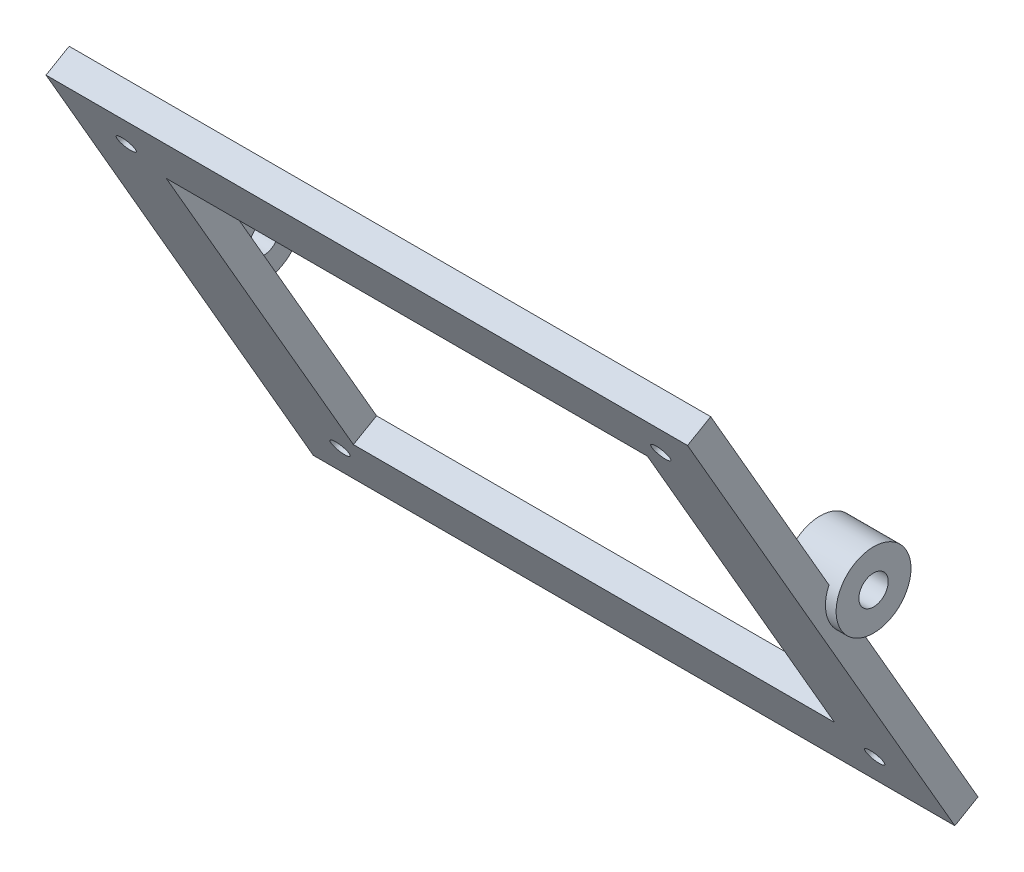
ISO-10303-21;
HEADER;
FILE_DESCRIPTION(('STEP AP214'),'2;1');
FILE_NAME('part.step','',(''),(''),'','','');
FILE_SCHEMA(('AUTOMOTIVE_DESIGN { 1 0 10303 214 1 1 1 1 }'));
ENDSEC;
DATA;
#1=APPLICATION_CONTEXT('core data for automotive mechanical design processes');
#2=APPLICATION_PROTOCOL_DEFINITION('international standard','automotive_design',2000,#1);
#3=PRODUCT_CONTEXT('',#1,'mechanical');
#4=PRODUCT('Part','Part','',(#3));
#5=PRODUCT_RELATED_PRODUCT_CATEGORY('part','',(#4));
#6=PRODUCT_DEFINITION_FORMATION('','',#4);
#7=PRODUCT_DEFINITION_CONTEXT('part definition',#1,'design');
#8=PRODUCT_DEFINITION('design','',#6,#7);
#9=PRODUCT_DEFINITION_SHAPE('','',#8);
#10=(LENGTH_UNIT() NAMED_UNIT(*) SI_UNIT(.MILLI.,.METRE.));
#11=(NAMED_UNIT(*) PLANE_ANGLE_UNIT() SI_UNIT($,.RADIAN.));
#12=(NAMED_UNIT(*) SI_UNIT($,.STERADIAN.) SOLID_ANGLE_UNIT());
#13=UNCERTAINTY_MEASURE_WITH_UNIT(LENGTH_MEASURE(1.E-05),#10,'distance_accuracy_value','');
#14=(GEOMETRIC_REPRESENTATION_CONTEXT(3) GLOBAL_UNCERTAINTY_ASSIGNED_CONTEXT((#13)) GLOBAL_UNIT_ASSIGNED_CONTEXT((#10,
#11,#12)) REPRESENTATION_CONTEXT('',''));
#15=CARTESIAN_POINT('',(0.,0.,0.));
#16=DIRECTION('',(0.,0.,1.));
#17=DIRECTION('',(1.,0.,0.));
#18=AXIS2_PLACEMENT_3D('',#15,#16,#17);
#19=CARTESIAN_POINT('',(114.0063,47.8013,21.535898384862));
#20=DIRECTION('',(1.,0.,0.));
#21=DIRECTION('',(0.,0.,-1.));
#22=AXIS2_PLACEMENT_3D('',#19,#20,#21);
#23=CYLINDRICAL_SURFACE('',#22,2.75);
#24=CARTESIAN_POINT('',(114.0063,47.8013,21.535898384862));
#25=DIRECTION('',(1.,0.,0.));
#26=DIRECTION('',(0.,0.,-1.));
#27=AXIS2_PLACEMENT_3D('',#24,#25,#26);
#28=CIRCLE('',#27,2.75);
#29=CARTESIAN_POINT('',(114.0063,47.8013,18.785898384862));
#30=VERTEX_POINT('',#29);
#31=EDGE_CURVE('E178',#30,#30,#28,.F.);
#32=ORIENTED_EDGE('',*,*,#31,.T.);
#33=EDGE_LOOP('',(#32));
#34=FACE_BOUND('',#33,.T.);
#35=CARTESIAN_POINT('',(124.0063,47.8013,21.535898384862));
#36=DIRECTION('',(1.,0.,0.));
#37=DIRECTION('',(0.,0.,-1.));
#38=AXIS2_PLACEMENT_3D('',#35,#36,#37);
#39=CIRCLE('',#38,2.75);
#40=CARTESIAN_POINT('',(124.0063,47.8013,18.785898384862));
#41=VERTEX_POINT('',#40);
#42=EDGE_CURVE('E180',#41,#41,#39,.F.);
#43=ORIENTED_EDGE('',*,*,#42,.F.);
#44=EDGE_LOOP('',(#43));
#45=FACE_BOUND('',#44,.T.);
#46=ADVANCED_FACE('F16',(#34,#45),#23,.F.);
#47=CARTESIAN_POINT('',(0.00630000000001,47.8013,21.535898384862));
#48=DIRECTION('',(1.,0.,0.));
#49=DIRECTION('',(0.,0.,-1.));
#50=AXIS2_PLACEMENT_3D('',#47,#48,#49);
#51=CYLINDRICAL_SURFACE('',#50,2.75);
#52=CARTESIAN_POINT('',(0.00630000000001,47.8013,21.535898384862));
#53=DIRECTION('',(1.,0.,0.));
#54=DIRECTION('',(0.,0.,-1.));
#55=AXIS2_PLACEMENT_3D('',#52,#53,#54);
#56=CIRCLE('',#55,2.75);
#57=CARTESIAN_POINT('',(0.00630000000001,47.8013,18.785898384862));
#58=VERTEX_POINT('',#57);
#59=EDGE_CURVE('E19',#58,#58,#56,.F.);
#60=ORIENTED_EDGE('',*,*,#59,.T.);
#61=EDGE_LOOP('',(#60));
#62=FACE_BOUND('',#61,.T.);
#63=CARTESIAN_POINT('',(10.0063,47.8013,21.535898384862));
#64=DIRECTION('',(1.,0.,0.));
#65=DIRECTION('',(0.,0.,-1.));
#66=AXIS2_PLACEMENT_3D('',#63,#64,#65);
#67=CIRCLE('',#66,2.75);
#68=CARTESIAN_POINT('',(10.0063,47.8013,18.785898384862));
#69=VERTEX_POINT('',#68);
#70=EDGE_CURVE('E119',#69,#69,#67,.F.);
#71=ORIENTED_EDGE('',*,*,#70,.F.);
#72=EDGE_LOOP('',(#71));
#73=FACE_BOUND('',#72,.T.);
#74=ADVANCED_FACE('F187',(#62,#73),#51,.F.);
#75=CARTESIAN_POINT('',(0.00630000000001,47.8013,21.535898384862));
#76=DIRECTION('',(1.,0.,0.));
#77=DIRECTION('',(0.,0.,-1.));
#78=AXIS2_PLACEMENT_3D('',#75,#76,#77);
#79=PLANE('',#78);
#80=ORIENTED_EDGE('',*,*,#59,.F.);
#81=EDGE_LOOP('',(#80));
#82=FACE_BOUND('',#81,.T.);
#83=CARTESIAN_POINT('',(0.00630000000001,47.8013,21.535898384862));
#84=DIRECTION('',(1.,0.,0.));
#85=DIRECTION('',(0.,0.,-1.));
#86=AXIS2_PLACEMENT_3D('',#83,#84,#85);
#87=CIRCLE('',#86,7.);
#88=CARTESIAN_POINT('',(0.00630000000001,47.8013,14.535898384862));
#89=VERTEX_POINT('',#88);
#90=EDGE_CURVE('E118',#89,#89,#87,.T.);
#91=ORIENTED_EDGE('',*,*,#90,.F.);
#92=EDGE_LOOP('',(#91));
#93=FACE_BOUND('',#92,.T.);
#94=ADVANCED_FACE('F190',(#82,#93),#79,.F.);
#95=CARTESIAN_POINT('',(124.0063,47.8013,21.535898384862));
#96=DIRECTION('',(1.,0.,0.));
#97=DIRECTION('',(0.,0.,-1.));
#98=AXIS2_PLACEMENT_3D('',#95,#96,#97);
#99=PLANE('',#98);
#100=ORIENTED_EDGE('',*,*,#42,.T.);
#101=EDGE_LOOP('',(#100));
#102=FACE_BOUND('',#101,.T.);
#103=CARTESIAN_POINT('',(124.0063,47.8013,21.535898384862));
#104=DIRECTION('',(1.,0.,0.));
#105=DIRECTION('',(0.,0.,-1.));
#106=AXIS2_PLACEMENT_3D('',#103,#104,#105);
#107=CIRCLE('',#106,7.);
#108=CARTESIAN_POINT('',(124.0063,47.8013,14.535898384862));
#109=VERTEX_POINT('',#108);
#110=EDGE_CURVE('E171',#109,#109,#107,.F.);
#111=ORIENTED_EDGE('',*,*,#110,.F.);
#112=EDGE_LOOP('',(#111));
#113=FACE_BOUND('',#112,.T.);
#114=ADVANCED_FACE('F193',(#102,#113),#99,.T.);
#115=CARTESIAN_POINT('',(114.0063,47.8013,21.535898384862));
#116=DIRECTION('',(1.,0.,0.));
#117=DIRECTION('',(0.,0.,-1.));
#118=AXIS2_PLACEMENT_3D('',#115,#116,#117);
#119=PLANE('',#118);
#120=ORIENTED_EDGE('',*,*,#31,.F.);
#121=EDGE_LOOP('',(#120));
#122=FACE_BOUND('',#121,.T.);
#123=DIRECTION('',(0.,-0.866025403784329,-0.50000000000019));
#124=VECTOR('',#123,1.);
#125=CARTESIAN_POINT('',(114.0063,2.500029810778,0.));
#126=LINE('',#125,#124);
#127=CARTESIAN_POINT('',(114.0063,40.826362814465,22.1277186767411));
#128=VERTEX_POINT('',#127);
#129=CARTESIAN_POINT('',(114.0063,50.7762371855231,27.8722813232774));
#130=VERTEX_POINT('',#129);
#131=EDGE_CURVE('E131',#128,#130,#126,.F.);
#132=ORIENTED_EDGE('',*,*,#131,.T.);
#133=CARTESIAN_POINT('',(114.0063,47.8013,21.535898384862));
#134=DIRECTION('',(1.,0.,0.));
#135=DIRECTION('',(0.,0.,-1.));
#136=AXIS2_PLACEMENT_3D('',#133,#134,#135);
#137=CIRCLE('',#136,7.);
#138=EDGE_CURVE('E168',#128,#130,#137,.T.);
#139=ORIENTED_EDGE('',*,*,#138,.F.);
#140=EDGE_LOOP('',(#132,#139));
#141=FACE_BOUND('',#140,.T.);
#142=ADVANCED_FACE('F207',(#122,#141),#119,.F.);
#143=CARTESIAN_POINT('',(10.0063,47.8013,21.535898384862));
#144=DIRECTION('',(1.,0.,0.));
#145=DIRECTION('',(0.,0.,-1.));
#146=AXIS2_PLACEMENT_3D('',#143,#144,#145);
#147=PLANE('',#146);
#148=ORIENTED_EDGE('',*,*,#70,.T.);
#149=EDGE_LOOP('',(#148));
#150=FACE_BOUND('',#149,.T.);
#151=DIRECTION('',(0.,-0.866025403784329,-0.50000000000019));
#152=VECTOR('',#151,1.);
#153=CARTESIAN_POINT('',(10.0063,2.500029810778,0.));
#154=LINE('',#153,#152);
#155=CARTESIAN_POINT('',(10.0063,50.7762371855231,27.8722813232774));
#156=VERTEX_POINT('',#155);
#157=CARTESIAN_POINT('',(10.0063,40.826362814465,22.1277186767411));
#158=VERTEX_POINT('',#157);
#159=EDGE_CURVE('E106',#156,#158,#154,.T.);
#160=ORIENTED_EDGE('',*,*,#159,.T.);
#161=CARTESIAN_POINT('',(10.0063,47.8013,21.535898384862));
#162=DIRECTION('',(1.,0.,0.));
#163=DIRECTION('',(0.,0.,-1.));
#164=AXIS2_PLACEMENT_3D('',#161,#162,#163);
#165=CIRCLE('',#164,7.);
#166=EDGE_CURVE('E103',#156,#158,#165,.F.);
#167=ORIENTED_EDGE('',*,*,#166,.F.);
#168=EDGE_LOOP('',(#160,#167));
#169=FACE_BOUND('',#168,.T.);
#170=ADVANCED_FACE('F107',(#150,#169),#147,.T.);
#171=CARTESIAN_POINT('',(0.00630000000001,47.8013,21.535898384862));
#172=DIRECTION('',(1.,0.,0.));
#173=DIRECTION('',(0.,0.,-1.));
#174=AXIS2_PLACEMENT_3D('',#171,#172,#173);
#175=CYLINDRICAL_SURFACE('',#174,7.);
#176=ORIENTED_EDGE('',*,*,#90,.T.);
#177=EDGE_LOOP('',(#176));
#178=FACE_BOUND('',#177,.T.);
#179=CARTESIAN_POINT('',(2.0063,47.8013,21.535898384862));
#180=DIRECTION('',(1.,0.,0.));
#181=DIRECTION('',(0.,0.,-1.));
#182=AXIS2_PLACEMENT_3D('',#179,#180,#181);
#183=CIRCLE('',#182,7.);
#184=CARTESIAN_POINT('',(2.0063,40.8263628144645,22.1277186767352));
#185=VERTEX_POINT('',#184);
#186=CARTESIAN_POINT('',(2.0063,50.7762371855299,27.8722813232742));
#187=VERTEX_POINT('',#186);
#188=EDGE_CURVE('E125',#185,#187,#183,.F.);
#189=ORIENTED_EDGE('',*,*,#188,.T.);
#190=DIRECTION('',(1.,0.,0.));
#191=VECTOR('',#190,1.);
#192=CARTESIAN_POINT('',(2.0063,50.7762371855269,27.8722813232796));
#193=LINE('',#192,#191);
#194=EDGE_CURVE('E112',#187,#156,#193,.T.);
#195=ORIENTED_EDGE('',*,*,#194,.T.);
#196=ORIENTED_EDGE('',*,*,#166,.T.);
#197=DIRECTION('',(1.,0.,0.));
#198=VECTOR('',#197,1.);
#199=CARTESIAN_POINT('',(2.0063,40.8263628144621,22.1277186767395));
#200=LINE('',#199,#198);
#201=EDGE_CURVE('E111',#158,#185,#200,.F.);
#202=ORIENTED_EDGE('',*,*,#201,.T.);
#203=EDGE_LOOP('',(#189,#195,#196,#202));
#204=FACE_BOUND('',#203,.T.);
#205=ADVANCED_FACE('F116',(#178,#204),#175,.T.);
#206=CARTESIAN_POINT('',(114.0063,47.8013,21.535898384862));
#207=DIRECTION('',(1.,0.,0.));
#208=DIRECTION('',(0.,0.,-1.));
#209=AXIS2_PLACEMENT_3D('',#206,#207,#208);
#210=CYLINDRICAL_SURFACE('',#209,7.);
#211=ORIENTED_EDGE('',*,*,#110,.T.);
#212=EDGE_LOOP('',(#211));
#213=FACE_BOUND('',#212,.T.);
#214=DIRECTION('',(1.,0.,0.));
#215=VECTOR('',#214,1.);
#216=CARTESIAN_POINT('',(2.0063,50.7762371855269,27.8722813232796));
#217=LINE('',#216,#215);
#218=CARTESIAN_POINT('',(122.0063,50.7762371855299,27.8722813232742));
#219=VERTEX_POINT('',#218);
#220=EDGE_CURVE('E132',#130,#219,#217,.T.);
#221=ORIENTED_EDGE('',*,*,#220,.T.);
#222=CARTESIAN_POINT('',(122.0063,47.8013,21.535898384862));
#223=DIRECTION('',(1.,0.,0.));
#224=DIRECTION('',(0.,0.,-1.));
#225=AXIS2_PLACEMENT_3D('',#222,#223,#224);
#226=CIRCLE('',#225,7.);
#227=CARTESIAN_POINT('',(122.0063,40.8263628144645,22.1277186767352));
#228=VERTEX_POINT('',#227);
#229=EDGE_CURVE('E161',#228,#219,#226,.F.);
#230=ORIENTED_EDGE('',*,*,#229,.F.);
#231=DIRECTION('',(1.,0.,0.));
#232=VECTOR('',#231,1.);
#233=CARTESIAN_POINT('',(2.0063,40.8263628144621,22.1277186767395));
#234=LINE('',#233,#232);
#235=EDGE_CURVE('E133',#228,#128,#234,.F.);
#236=ORIENTED_EDGE('',*,*,#235,.T.);
#237=ORIENTED_EDGE('',*,*,#138,.T.);
#238=EDGE_LOOP('',(#221,#230,#236,#237));
#239=FACE_BOUND('',#238,.T.);
#240=ADVANCED_FACE('F198',(#213,#239),#210,.T.);
#241=CARTESIAN_POINT('',(2.0063,2.500029810778,0.));
#242=DIRECTION('',(0.,-0.50000000000019,0.866025403784329));
#243=DIRECTION('',(0.,-0.866025403784329,-0.50000000000019));
#244=AXIS2_PLACEMENT_3D('',#241,#242,#243);
#245=PLANE('',#244);
#246=CARTESIAN_POINT('',(112.0063,80.442316151378,45.));
#247=DIRECTION('',(0.,-0.50000000000019,0.866025403784329));
#248=DIRECTION('',(0.,-0.866025403784329,-0.50000000000019));
#249=AXIS2_PLACEMENT_3D('',#246,#247,#248);
#250=CIRCLE('',#249,1.7);
#251=CARTESIAN_POINT('',(112.0063,78.9700729649446,44.1499999999997));
#252=VERTEX_POINT('',#251);
#253=EDGE_CURVE('E146',#252,#252,#250,.T.);
#254=ORIENTED_EDGE('',*,*,#253,.T.);
#255=EDGE_LOOP('',(#254));
#256=FACE_BOUND('',#255,.T.);
#257=DIRECTION('',(0.,0.866025403784436,0.500000000000004));
#258=VECTOR('',#257,1.);
#259=CARTESIAN_POINT('',(107.0063,15.490410867545,7.5));
#260=LINE('',#259,#258);
#261=CARTESIAN_POINT('',(107.0063,15.4904108675441,7.50000000000152));
#262=VERTEX_POINT('',#261);
#263=CARTESIAN_POINT('',(107.0063,76.1121891324504,42.500000000008));
#264=VERTEX_POINT('',#263);
#265=EDGE_CURVE('E272',#262,#264,#260,.T.);
#266=ORIENTED_EDGE('',*,*,#265,.T.);
#267=DIRECTION('',(1.,0.,0.));
#268=VECTOR('',#267,1.);
#269=CARTESIAN_POINT('',(17.0063,76.112189132455,42.5));
#270=LINE('',#269,#268);
#271=CARTESIAN_POINT('',(17.0063,76.1121891324504,42.500000000008));
#272=VERTEX_POINT('',#271);
#273=EDGE_CURVE('E346',#264,#272,#270,.F.);
#274=ORIENTED_EDGE('',*,*,#273,.T.);
#275=DIRECTION('',(0.,0.866025403784436,0.500000000000004));
#276=VECTOR('',#275,1.);
#277=CARTESIAN_POINT('',(17.0063,15.490410867545,7.5));
#278=LINE('',#277,#276);
#279=CARTESIAN_POINT('',(17.0063,15.4904108675441,7.50000000000152));
#280=VERTEX_POINT('',#279);
#281=EDGE_CURVE('E153',#280,#272,#278,.T.);
#282=ORIENTED_EDGE('',*,*,#281,.F.);
#283=DIRECTION('',(1.,0.,0.));
#284=VECTOR('',#283,1.);
#285=CARTESIAN_POINT('',(17.0063,15.490410867545,7.5));
#286=LINE('',#285,#284);
#287=EDGE_CURVE('E353',#262,#280,#286,.F.);
#288=ORIENTED_EDGE('',*,*,#287,.F.);
#289=EDGE_LOOP('',(#266,#274,#282,#288));
#290=FACE_BOUND('',#289,.T.);
#291=CARTESIAN_POINT('',(12.0063,80.442316151378,45.));
#292=DIRECTION('',(0.,-0.50000000000019,0.866025403784329));
#293=DIRECTION('',(0.,-0.866025403784329,-0.50000000000019));
#294=AXIS2_PLACEMENT_3D('',#291,#292,#293);
#295=CIRCLE('',#294,1.7);
#296=CARTESIAN_POINT('',(12.0063,78.9700729649446,44.1499999999997));
#297=VERTEX_POINT('',#296);
#298=EDGE_CURVE('E150',#297,#297,#295,.T.);
#299=ORIENTED_EDGE('',*,*,#298,.T.);
#300=EDGE_LOOP('',(#299));
#301=FACE_BOUND('',#300,.T.);
#302=CARTESIAN_POINT('',(112.0063,11.160283848622,5.));
#303=DIRECTION('',(0.,-0.50000000000019,0.866025403784329));
#304=DIRECTION('',(0.,-0.866025403784329,-0.50000000000019));
#305=AXIS2_PLACEMENT_3D('',#302,#303,#304);
#306=CIRCLE('',#305,1.7);
#307=CARTESIAN_POINT('',(112.0063,9.68804066218864,4.14999999999968));
#308=VERTEX_POINT('',#307);
#309=EDGE_CURVE('E154',#308,#308,#306,.T.);
#310=ORIENTED_EDGE('',*,*,#309,.T.);
#311=EDGE_LOOP('',(#310));
#312=FACE_BOUND('',#311,.T.);
#313=CARTESIAN_POINT('',(12.0063,11.160283848622,5.));
#314=DIRECTION('',(0.,-0.50000000000019,0.866025403784329));
#315=DIRECTION('',(0.,-0.866025403784329,-0.50000000000019));
#316=AXIS2_PLACEMENT_3D('',#313,#314,#315);
#317=CIRCLE('',#316,1.7);
#318=CARTESIAN_POINT('',(12.0063,9.68804066218864,4.14999999999968));
#319=VERTEX_POINT('',#318);
#320=EDGE_CURVE('E157',#319,#319,#317,.T.);
#321=ORIENTED_EDGE('',*,*,#320,.T.);
#322=EDGE_LOOP('',(#321));
#323=FACE_BOUND('',#322,.T.);
#324=ORIENTED_EDGE('',*,*,#159,.F.);
#325=ORIENTED_EDGE('',*,*,#194,.F.);
#326=DIRECTION('',(0.,0.866025403784439,0.499999999999999));
#327=VECTOR('',#326,1.);
#328=CARTESIAN_POINT('',(2.0063,50.776237185533,27.872281323269));
#329=LINE('',#328,#327);
#330=CARTESIAN_POINT('',(2.0063,89.102570189222,50.));
#331=VERTEX_POINT('',#330);
#332=EDGE_CURVE('E167',#187,#331,#329,.T.);
#333=ORIENTED_EDGE('',*,*,#332,.T.);
#334=DIRECTION('',(1.,0.,0.));
#335=VECTOR('',#334,1.);
#336=CARTESIAN_POINT('',(2.0063,89.102570189222,50.));
#337=LINE('',#336,#335);
#338=CARTESIAN_POINT('',(122.0063,89.102570189222,50.));
#339=VERTEX_POINT('',#338);
#340=EDGE_CURVE('E312',#339,#331,#337,.F.);
#341=ORIENTED_EDGE('',*,*,#340,.F.);
#342=DIRECTION('',(0.,0.866025403784439,0.499999999999999));
#343=VECTOR('',#342,1.);
#344=CARTESIAN_POINT('',(122.0063,50.776237185533,27.872281323269));
#345=LINE('',#344,#343);
#346=EDGE_CURVE('E164',#219,#339,#345,.T.);
#347=ORIENTED_EDGE('',*,*,#346,.F.);
#348=ORIENTED_EDGE('',*,*,#220,.F.);
#349=ORIENTED_EDGE('',*,*,#131,.F.);
#350=ORIENTED_EDGE('',*,*,#235,.F.);
#351=DIRECTION('',(0.,0.866025403784439,0.499999999999999));
#352=VECTOR('',#351,1.);
#353=CARTESIAN_POINT('',(122.0063,2.500029810778,0.));
#354=LINE('',#353,#352);
#355=CARTESIAN_POINT('',(122.0063,2.500029810778,0.));
#356=VERTEX_POINT('',#355);
#357=EDGE_CURVE('E165',#356,#228,#354,.T.);
#358=ORIENTED_EDGE('',*,*,#357,.F.);
#359=DIRECTION('',(1.,0.,0.));
#360=VECTOR('',#359,1.);
#361=CARTESIAN_POINT('',(2.0063,2.500029810778,0.));
#362=LINE('',#361,#360);
#363=CARTESIAN_POINT('',(2.0063,2.500029810778,0.));
#364=VERTEX_POINT('',#363);
#365=EDGE_CURVE('E307',#356,#364,#362,.F.);
#366=ORIENTED_EDGE('',*,*,#365,.T.);
#367=DIRECTION('',(0.,0.866025403784439,0.499999999999999));
#368=VECTOR('',#367,1.);
#369=CARTESIAN_POINT('',(2.0063,2.500029810778,0.));
#370=LINE('',#369,#368);
#371=EDGE_CURVE('E123',#364,#185,#370,.T.);
#372=ORIENTED_EDGE('',*,*,#371,.T.);
#373=ORIENTED_EDGE('',*,*,#201,.F.);
#374=EDGE_LOOP('',(#324,#325,#333,#341,#347,#348,#349,#350,#358,#366,#372,#373));
#375=FACE_BOUND('',#374,.T.);
#376=ADVANCED_FACE('F121',(#256,#290,#301,#312,#323,#375),#245,.F.);
#377=CARTESIAN_POINT('',(2.0063,2.500029810778,0.));
#378=DIRECTION('',(1.,0.,0.));
#379=DIRECTION('',(0.,0.,-1.));
#380=AXIS2_PLACEMENT_3D('',#377,#378,#379);
#381=PLANE('',#380);
#382=ORIENTED_EDGE('',*,*,#332,.F.);
#383=ORIENTED_EDGE('',*,*,#188,.F.);
#384=ORIENTED_EDGE('',*,*,#371,.F.);
#385=DIRECTION('',(0.,-0.50000000000019,0.866025403784329));
#386=VECTOR('',#385,1.);
#387=CARTESIAN_POINT('',(2.0063,2.500029810778,0.));
#388=LINE('',#387,#386);
#389=CARTESIAN_POINT('',(2.0063,2.98107778301914E-05,4.33012701892187));
#390=VERTEX_POINT('',#389);
#391=EDGE_CURVE('E304',#364,#390,#388,.T.);
#392=ORIENTED_EDGE('',*,*,#391,.T.);
#393=DIRECTION('',(0.,-0.866025403784329,-0.50000000000019));
#394=VECTOR('',#393,1.);
#395=CARTESIAN_POINT('',(2.0063,2.981077805941E-05,4.330127018922));
#396=LINE('',#395,#394);
#397=CARTESIAN_POINT('',(2.0063,86.6025701892191,54.3301270189266));
#398=VERTEX_POINT('',#397);
#399=EDGE_CURVE('E149',#398,#390,#396,.T.);
#400=ORIENTED_EDGE('',*,*,#399,.F.);
#401=DIRECTION('',(0.,-0.50000000000019,0.866025403784329));
#402=VECTOR('',#401,1.);
#403=CARTESIAN_POINT('',(2.0063,89.102570189222,50.));
#404=LINE('',#403,#402);
#405=EDGE_CURVE('E310',#331,#398,#404,.T.);
#406=ORIENTED_EDGE('',*,*,#405,.F.);
#407=EDGE_LOOP('',(#382,#383,#384,#392,#400,#406));
#408=FACE_BOUND('',#407,.T.);
#409=ADVANCED_FACE('F260',(#408),#381,.F.);
#410=CARTESIAN_POINT('',(2.0063,2.500029810778,0.));
#411=DIRECTION('',(0.,0.866025403784329,0.50000000000019));
#412=DIRECTION('',(0.,-0.50000000000019,0.866025403784329));
#413=AXIS2_PLACEMENT_3D('',#410,#411,#412);
#414=PLANE('',#413);
#415=DIRECTION('',(1.,0.,0.));
#416=VECTOR('',#415,1.);
#417=CARTESIAN_POINT('',(2.0063,2.981077805941E-05,4.330127018922));
#418=LINE('',#417,#416);
#419=CARTESIAN_POINT('',(122.0063,2.98107780589193E-05,4.330127018922));
#420=VERTEX_POINT('',#419);
#421=EDGE_CURVE('E291',#390,#420,#418,.T.);
#422=ORIENTED_EDGE('',*,*,#421,.F.);
#423=ORIENTED_EDGE('',*,*,#391,.F.);
#424=ORIENTED_EDGE('',*,*,#365,.F.);
#425=DIRECTION('',(0.,0.500000000000008,-0.866025403784434));
#426=VECTOR('',#425,1.);
#427=CARTESIAN_POINT('',(122.0063,2.98107780596218E-05,4.330127018922));
#428=LINE('',#427,#426);
#429=EDGE_CURVE('E306',#420,#356,#428,.T.);
#430=ORIENTED_EDGE('',*,*,#429,.F.);
#431=EDGE_LOOP('',(#422,#423,#424,#430));
#432=FACE_BOUND('',#431,.T.);
#433=ADVANCED_FACE('F256',(#432),#414,.F.);
#434=CARTESIAN_POINT('',(122.0063,2.500029810778,0.));
#435=DIRECTION('',(1.,0.,0.));
#436=DIRECTION('',(0.,0.,-1.));
#437=AXIS2_PLACEMENT_3D('',#434,#435,#436);
#438=PLANE('',#437);
#439=ORIENTED_EDGE('',*,*,#346,.T.);
#440=DIRECTION('',(0.,-0.50000000000019,0.866025403784329));
#441=VECTOR('',#440,1.);
#442=CARTESIAN_POINT('',(122.0063,89.102570189222,50.));
#443=LINE('',#442,#441);
#444=CARTESIAN_POINT('',(122.0063,86.6025701892191,54.3301270189266));
#445=VERTEX_POINT('',#444);
#446=EDGE_CURVE('E160',#445,#339,#443,.F.);
#447=ORIENTED_EDGE('',*,*,#446,.F.);
#448=DIRECTION('',(0.,-0.866025403784329,-0.50000000000019));
#449=VECTOR('',#448,1.);
#450=CARTESIAN_POINT('',(122.0063,2.981077805941E-05,4.330127018922));
#451=LINE('',#450,#449);
#452=EDGE_CURVE('E287',#420,#445,#451,.F.);
#453=ORIENTED_EDGE('',*,*,#452,.F.);
#454=ORIENTED_EDGE('',*,*,#429,.T.);
#455=ORIENTED_EDGE('',*,*,#357,.T.);
#456=ORIENTED_EDGE('',*,*,#229,.T.);
#457=EDGE_LOOP('',(#439,#447,#453,#454,#455,#456));
#458=FACE_BOUND('',#457,.T.);
#459=ADVANCED_FACE('F252',(#458),#438,.T.);
#460=CARTESIAN_POINT('',(2.0063,89.102570189222,50.));
#461=DIRECTION('',(0.,0.866025403784329,0.50000000000019));
#462=DIRECTION('',(0.,-0.50000000000019,0.866025403784329));
#463=AXIS2_PLACEMENT_3D('',#460,#461,#462);
#464=PLANE('',#463);
#465=DIRECTION('',(1.,0.,0.));
#466=VECTOR('',#465,1.);
#467=CARTESIAN_POINT('',(2.0063,86.602570189211,54.330127018941));
#468=LINE('',#467,#466);
#469=EDGE_CURVE('E145',#445,#398,#468,.F.);
#470=ORIENTED_EDGE('',*,*,#469,.F.);
#471=ORIENTED_EDGE('',*,*,#446,.T.);
#472=ORIENTED_EDGE('',*,*,#340,.T.);
#473=ORIENTED_EDGE('',*,*,#405,.T.);
#474=EDGE_LOOP('',(#470,#471,#472,#473));
#475=FACE_BOUND('',#474,.T.);
#476=ADVANCED_FACE('F248',(#475),#464,.T.);
#477=CARTESIAN_POINT('',(12.0063,11.160283848622,5.));
#478=DIRECTION('',(0.,-0.50000000000019,0.866025403784329));
#479=DIRECTION('',(0.,-0.866025403784329,-0.50000000000019));
#480=AXIS2_PLACEMENT_3D('',#477,#478,#479);
#481=CYLINDRICAL_SURFACE('',#480,1.7);
#482=ORIENTED_EDGE('',*,*,#320,.F.);
#483=EDGE_LOOP('',(#482));
#484=FACE_BOUND('',#483,.T.);
#485=CARTESIAN_POINT('',(12.0063,8.66028384862113,9.3301270189215));
#486=DIRECTION('',(0.,-0.50000000000019,0.866025403784329));
#487=DIRECTION('',(0.,-0.866025403784329,-0.50000000000019));
#488=AXIS2_PLACEMENT_3D('',#485,#486,#487);
#489=CIRCLE('',#488,1.7);
#490=CARTESIAN_POINT('',(12.0063,7.18804066218778,8.48012701892118));
#491=VERTEX_POINT('',#490);
#492=EDGE_CURVE('E142',#491,#491,#489,.F.);
#493=ORIENTED_EDGE('',*,*,#492,.F.);
#494=EDGE_LOOP('',(#493));
#495=FACE_BOUND('',#494,.T.);
#496=ADVANCED_FACE('F244',(#484,#495),#481,.F.);
#497=CARTESIAN_POINT('',(112.0063,11.160283848622,5.));
#498=DIRECTION('',(0.,-0.50000000000019,0.866025403784329));
#499=DIRECTION('',(0.,-0.866025403784329,-0.50000000000019));
#500=AXIS2_PLACEMENT_3D('',#497,#498,#499);
#501=CYLINDRICAL_SURFACE('',#500,1.7);
#502=ORIENTED_EDGE('',*,*,#309,.F.);
#503=EDGE_LOOP('',(#502));
#504=FACE_BOUND('',#503,.T.);
#505=CARTESIAN_POINT('',(112.0063,8.66028384862113,9.3301270189215));
#506=DIRECTION('',(0.,-0.50000000000019,0.866025403784329));
#507=DIRECTION('',(0.,-0.866025403784329,-0.50000000000019));
#508=AXIS2_PLACEMENT_3D('',#505,#506,#507);
#509=CIRCLE('',#508,1.7);
#510=CARTESIAN_POINT('',(112.0063,7.18804066218778,8.48012701892118));
#511=VERTEX_POINT('',#510);
#512=EDGE_CURVE('E139',#511,#511,#509,.F.);
#513=ORIENTED_EDGE('',*,*,#512,.F.);
#514=EDGE_LOOP('',(#513));
#515=FACE_BOUND('',#514,.T.);
#516=ADVANCED_FACE('F240',(#504,#515),#501,.F.);
#517=CARTESIAN_POINT('',(12.0063,80.442316151378,45.));
#518=DIRECTION('',(0.,-0.50000000000019,0.866025403784329));
#519=DIRECTION('',(0.,-0.866025403784329,-0.50000000000019));
#520=AXIS2_PLACEMENT_3D('',#517,#518,#519);
#521=CYLINDRICAL_SURFACE('',#520,1.7);
#522=ORIENTED_EDGE('',*,*,#298,.F.);
#523=EDGE_LOOP('',(#522));
#524=FACE_BOUND('',#523,.T.);
#525=CARTESIAN_POINT('',(12.0063,77.9423161513771,49.3301270189215));
#526=DIRECTION('',(0.,-0.50000000000019,0.866025403784329));
#527=DIRECTION('',(0.,-0.866025403784329,-0.50000000000019));
#528=AXIS2_PLACEMENT_3D('',#525,#526,#527);
#529=CIRCLE('',#528,1.7);
#530=CARTESIAN_POINT('',(12.0063,76.4700729649438,48.4801270189212));
#531=VERTEX_POINT('',#530);
#532=EDGE_CURVE('E135',#531,#531,#529,.F.);
#533=ORIENTED_EDGE('',*,*,#532,.F.);
#534=EDGE_LOOP('',(#533));
#535=FACE_BOUND('',#534,.T.);
#536=ADVANCED_FACE('F236',(#524,#535),#521,.F.);
#537=CARTESIAN_POINT('',(17.0063,15.490410867545,7.5));
#538=DIRECTION('',(1.,0.,0.));
#539=DIRECTION('',(0.,0.,-1.));
#540=AXIS2_PLACEMENT_3D('',#537,#538,#539);
#541=PLANE('',#540);
#542=DIRECTION('',(0.,-0.50000000000019,0.866025403784329));
#543=VECTOR('',#542,1.);
#544=CARTESIAN_POINT('',(17.0063,76.112189132455,42.5));
#545=LINE('',#544,#543);
#546=CARTESIAN_POINT('',(17.0063,73.6121891324525,46.8301270189259));
#547=VERTEX_POINT('',#546);
#548=EDGE_CURVE('E348',#272,#547,#545,.T.);
#549=ORIENTED_EDGE('',*,*,#548,.T.);
#550=DIRECTION('',(0.,-0.866025403784329,-0.50000000000019));
#551=VECTOR('',#550,1.);
#552=CARTESIAN_POINT('',(17.0063,2.981077805941E-05,4.330127018922));
#553=LINE('',#552,#551);
#554=CARTESIAN_POINT('',(17.0063,12.9904108675444,11.8301270189226));
#555=VERTEX_POINT('',#554);
#556=EDGE_CURVE('E138',#555,#547,#553,.F.);
#557=ORIENTED_EDGE('',*,*,#556,.F.);
#558=DIRECTION('',(0.,-0.50000000000019,0.866025403784329));
#559=VECTOR('',#558,1.);
#560=CARTESIAN_POINT('',(17.0063,15.490410867545,7.5));
#561=LINE('',#560,#559);
#562=EDGE_CURVE('E356',#280,#555,#561,.T.);
#563=ORIENTED_EDGE('',*,*,#562,.F.);
#564=ORIENTED_EDGE('',*,*,#281,.T.);
#565=EDGE_LOOP('',(#549,#557,#563,#564));
#566=FACE_BOUND('',#565,.T.);
#567=ADVANCED_FACE('F232',(#566),#541,.T.);
#568=CARTESIAN_POINT('',(17.0063,76.112189132455,42.5));
#569=DIRECTION('',(0.,0.866025403784329,0.50000000000019));
#570=DIRECTION('',(0.,-0.50000000000019,0.866025403784329));
#571=AXIS2_PLACEMENT_3D('',#568,#569,#570);
#572=PLANE('',#571);
#573=DIRECTION('',(1.,0.,0.));
#574=VECTOR('',#573,1.);
#575=CARTESIAN_POINT('',(2.0063,73.6121891324458,46.830127018938));
#576=LINE('',#575,#574);
#577=CARTESIAN_POINT('',(107.0063,73.6121891324523,46.8301270189258));
#578=VERTEX_POINT('',#577);
#579=EDGE_CURVE('E363',#547,#578,#576,.T.);
#580=ORIENTED_EDGE('',*,*,#579,.F.);
#581=ORIENTED_EDGE('',*,*,#548,.F.);
#582=ORIENTED_EDGE('',*,*,#273,.F.);
#583=DIRECTION('',(0.,-0.500000000000017,0.866025403784429));
#584=VECTOR('',#583,1.);
#585=CARTESIAN_POINT('',(107.0063,76.112189132455,42.5));
#586=LINE('',#585,#584);
#587=EDGE_CURVE('E351',#264,#578,#586,.T.);
#588=ORIENTED_EDGE('',*,*,#587,.T.);
#589=EDGE_LOOP('',(#580,#581,#582,#588));
#590=FACE_BOUND('',#589,.T.);
#591=ADVANCED_FACE('F229',(#590),#572,.F.);
#592=CARTESIAN_POINT('',(107.0063,15.490410867545,7.5));
#593=DIRECTION('',(1.,0.,0.));
#594=DIRECTION('',(0.,0.,-1.));
#595=AXIS2_PLACEMENT_3D('',#592,#593,#594);
#596=PLANE('',#595);
#597=ORIENTED_EDGE('',*,*,#587,.F.);
#598=ORIENTED_EDGE('',*,*,#265,.F.);
#599=DIRECTION('',(0.,-0.50000000000019,0.866025403784329));
#600=VECTOR('',#599,1.);
#601=CARTESIAN_POINT('',(107.0063,15.490410867545,7.5));
#602=LINE('',#601,#600);
#603=CARTESIAN_POINT('',(107.0063,12.9904108675444,11.8301270189226));
#604=VERTEX_POINT('',#603);
#605=EDGE_CURVE('E34',#604,#262,#602,.F.);
#606=ORIENTED_EDGE('',*,*,#605,.F.);
#607=DIRECTION('',(0.,-0.866025403784329,-0.50000000000019));
#608=VECTOR('',#607,1.);
#609=CARTESIAN_POINT('',(107.0063,2.981077805941E-05,4.330127018922));
#610=LINE('',#609,#608);
#611=EDGE_CURVE('E366',#578,#604,#610,.T.);
#612=ORIENTED_EDGE('',*,*,#611,.F.);
#613=EDGE_LOOP('',(#597,#598,#606,#612));
#614=FACE_BOUND('',#613,.T.);
#615=ADVANCED_FACE('F225',(#614),#596,.F.);
#616=CARTESIAN_POINT('',(17.0063,15.490410867545,7.5));
#617=DIRECTION('',(0.,0.866025403784329,0.50000000000019));
#618=DIRECTION('',(0.,-0.50000000000019,0.866025403784329));
#619=AXIS2_PLACEMENT_3D('',#616,#617,#618);
#620=PLANE('',#619);
#621=DIRECTION('',(1.,0.,0.));
#622=VECTOR('',#621,1.);
#623=CARTESIAN_POINT('',(2.0063,12.9904108675433,11.830127018925));
#624=LINE('',#623,#622);
#625=EDGE_CURVE('E25',#604,#555,#624,.F.);
#626=ORIENTED_EDGE('',*,*,#625,.F.);
#627=ORIENTED_EDGE('',*,*,#605,.T.);
#628=ORIENTED_EDGE('',*,*,#287,.T.);
#629=ORIENTED_EDGE('',*,*,#562,.T.);
#630=EDGE_LOOP('',(#626,#627,#628,#629));
#631=FACE_BOUND('',#630,.T.);
#632=ADVANCED_FACE('F218',(#631),#620,.T.);
#633=CARTESIAN_POINT('',(112.0063,80.442316151378,45.));
#634=DIRECTION('',(0.,-0.50000000000019,0.866025403784329));
#635=DIRECTION('',(0.,-0.866025403784329,-0.50000000000019));
#636=AXIS2_PLACEMENT_3D('',#633,#634,#635);
#637=CYLINDRICAL_SURFACE('',#636,1.7);
#638=ORIENTED_EDGE('',*,*,#253,.F.);
#639=EDGE_LOOP('',(#638));
#640=FACE_BOUND('',#639,.T.);
#641=CARTESIAN_POINT('',(112.0063,77.9423161513771,49.3301270189215));
#642=DIRECTION('',(0.,-0.50000000000019,0.866025403784329));
#643=DIRECTION('',(0.,-0.866025403784329,-0.50000000000019));
#644=AXIS2_PLACEMENT_3D('',#641,#642,#643);
#645=CIRCLE('',#644,1.7);
#646=CARTESIAN_POINT('',(112.0063,76.4700729649438,48.4801270189212));
#647=VERTEX_POINT('',#646);
#648=EDGE_CURVE('E11',#647,#647,#645,.F.);
#649=ORIENTED_EDGE('',*,*,#648,.F.);
#650=EDGE_LOOP('',(#649));
#651=FACE_BOUND('',#650,.T.);
#652=ADVANCED_FACE('F212',(#640,#651),#637,.F.);
#653=CARTESIAN_POINT('',(2.0063,2.981077805941E-05,4.330127018922));
#654=DIRECTION('',(0.,-0.50000000000019,0.866025403784329));
#655=DIRECTION('',(0.,-0.866025403784329,-0.50000000000019));
#656=AXIS2_PLACEMENT_3D('',#653,#654,#655);
#657=PLANE('',#656);
#658=ORIENTED_EDGE('',*,*,#648,.T.);
#659=EDGE_LOOP('',(#658));
#660=FACE_BOUND('',#659,.T.);
#661=ORIENTED_EDGE('',*,*,#611,.T.);
#662=ORIENTED_EDGE('',*,*,#625,.T.);
#663=ORIENTED_EDGE('',*,*,#556,.T.);
#664=ORIENTED_EDGE('',*,*,#579,.T.);
#665=EDGE_LOOP('',(#661,#662,#663,#664));
#666=FACE_BOUND('',#665,.T.);
#667=ORIENTED_EDGE('',*,*,#532,.T.);
#668=EDGE_LOOP('',(#667));
#669=FACE_BOUND('',#668,.T.);
#670=ORIENTED_EDGE('',*,*,#512,.T.);
#671=EDGE_LOOP('',(#670));
#672=FACE_BOUND('',#671,.T.);
#673=ORIENTED_EDGE('',*,*,#492,.T.);
#674=EDGE_LOOP('',(#673));
#675=FACE_BOUND('',#674,.T.);
#676=ORIENTED_EDGE('',*,*,#452,.T.);
#677=ORIENTED_EDGE('',*,*,#469,.T.);
#678=ORIENTED_EDGE('',*,*,#399,.T.);
#679=ORIENTED_EDGE('',*,*,#421,.T.);
#680=EDGE_LOOP('',(#676,#677,#678,#679));
#681=FACE_BOUND('',#680,.T.);
#682=ADVANCED_FACE('F210',(#660,#666,#669,#672,#675,#681),#657,.T.);
#683=CLOSED_SHELL('',(#46,#74,#94,#114,#142,#170,#205,#240,#376,#409,#433,#459,#476,#496,#516,
#536,#567,#591,#615,#632,#652,#682));
#684=MANIFOLD_SOLID_BREP('B1',#683);
#685=ADVANCED_BREP_SHAPE_REPRESENTATION('',(#18,#684),#14);
#686=SHAPE_DEFINITION_REPRESENTATION(#9,#685);
ENDSEC;
END-ISO-10303-21;
